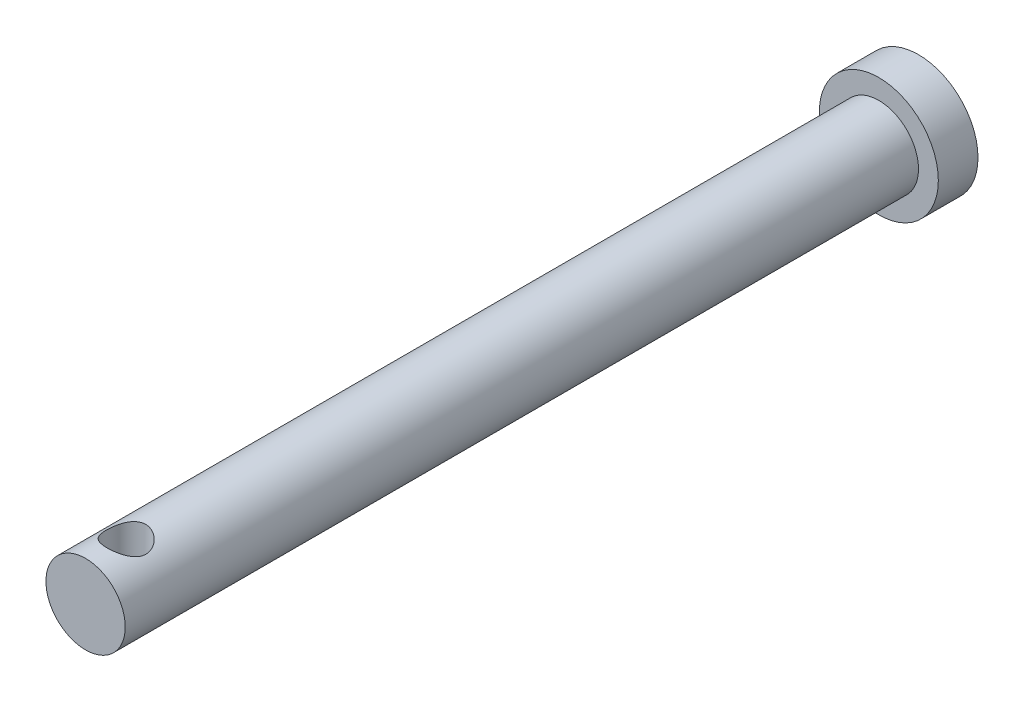
ISO-10303-21;
HEADER;
FILE_DESCRIPTION(('STEP AP214'),'2;1');
FILE_NAME('part.step','',(''),(''),'','','');
FILE_SCHEMA(('AUTOMOTIVE_DESIGN { 1 0 10303 214 1 1 1 1 }'));
ENDSEC;
DATA;
#1=APPLICATION_CONTEXT('core data for automotive mechanical design processes');
#2=APPLICATION_PROTOCOL_DEFINITION('international standard','automotive_design',2000,#1);
#3=PRODUCT_CONTEXT('',#1,'mechanical');
#4=PRODUCT('Part','Part','',(#3));
#5=PRODUCT_RELATED_PRODUCT_CATEGORY('part','',(#4));
#6=PRODUCT_DEFINITION_FORMATION('','',#4);
#7=PRODUCT_DEFINITION_CONTEXT('part definition',#1,'design');
#8=PRODUCT_DEFINITION('design','',#6,#7);
#9=PRODUCT_DEFINITION_SHAPE('','',#8);
#10=(LENGTH_UNIT() NAMED_UNIT(*) SI_UNIT(.MILLI.,.METRE.));
#11=(NAMED_UNIT(*) PLANE_ANGLE_UNIT() SI_UNIT($,.RADIAN.));
#12=(NAMED_UNIT(*) SI_UNIT($,.STERADIAN.) SOLID_ANGLE_UNIT());
#13=UNCERTAINTY_MEASURE_WITH_UNIT(LENGTH_MEASURE(1.E-05),#10,'distance_accuracy_value','');
#14=(GEOMETRIC_REPRESENTATION_CONTEXT(3) GLOBAL_UNCERTAINTY_ASSIGNED_CONTEXT((#13)) GLOBAL_UNIT_ASSIGNED_CONTEXT((#10,
#11,#12)) REPRESENTATION_CONTEXT('',''));
#15=CARTESIAN_POINT('',(0.,0.,0.));
#16=DIRECTION('',(0.,0.,1.));
#17=DIRECTION('',(1.,0.,0.));
#18=AXIS2_PLACEMENT_3D('',#15,#16,#17);
#19=CARTESIAN_POINT('',(0.,0.,-66.6750000000001));
#20=DIRECTION('',(0.,0.,1.));
#21=DIRECTION('',(1.,0.,0.));
#22=AXIS2_PLACEMENT_3D('',#19,#20,#21);
#23=PLANE('',#22);
#24=CARTESIAN_POINT('',(3.175,0.,-66.6750000000001));
#25=DIRECTION('',(0.,0.,1.));
#26=DIRECTION('',(1.,0.,0.));
#27=AXIS2_PLACEMENT_3D('',#24,#25,#26);
#28=CIRCLE('',#27,9.525);
#29=CARTESIAN_POINT('',(12.7,0.,-66.6750000000001));
#30=VERTEX_POINT('',#29);
#31=EDGE_CURVE('E10',#30,#30,#28,.T.);
#32=ORIENTED_EDGE('',*,*,#31,.F.);
#33=EDGE_LOOP('',(#32));
#34=FACE_BOUND('',#33,.T.);
#35=ADVANCED_FACE('F33',(#34),#23,.F.);
#36=CARTESIAN_POINT('',(3.175,0.,66.6749999999999));
#37=DIRECTION('',(0.,0.,1.));
#38=DIRECTION('',(1.,0.,0.));
#39=AXIS2_PLACEMENT_3D('',#36,#37,#38);
#40=CYLINDRICAL_SURFACE('',#39,9.525);
#41=CARTESIAN_POINT('',(3.175,0.,-60.3250000000001));
#42=DIRECTION('',(0.,0.,1.));
#43=DIRECTION('',(1.,0.,0.));
#44=AXIS2_PLACEMENT_3D('',#41,#42,#43);
#45=CIRCLE('',#44,9.525);
#46=CARTESIAN_POINT('',(12.7,0.,-60.3250000000001));
#47=VERTEX_POINT('',#46);
#48=EDGE_CURVE('E44',#47,#47,#45,.T.);
#49=ORIENTED_EDGE('',*,*,#48,.F.);
#50=EDGE_LOOP('',(#49));
#51=FACE_BOUND('',#50,.T.);
#52=ORIENTED_EDGE('',*,*,#31,.T.);
#53=EDGE_LOOP('',(#52));
#54=FACE_BOUND('',#53,.T.);
#55=ADVANCED_FACE('F75',(#51,#54),#40,.T.);
#56=CARTESIAN_POINT('',(1.31838984174237E-13,0.,-60.3250000000001));
#57=DIRECTION('',(0.,0.,1.));
#58=DIRECTION('',(1.,0.,0.));
#59=AXIS2_PLACEMENT_3D('',#56,#57,#58);
#60=PLANE('',#59);
#61=ORIENTED_EDGE('',*,*,#48,.T.);
#62=EDGE_LOOP('',(#61));
#63=FACE_BOUND('',#62,.T.);
#64=CARTESIAN_POINT('',(3.175,0.,-60.3250000000001));
#65=DIRECTION('',(0.,0.,1.));
#66=DIRECTION('',(1.,0.,0.));
#67=AXIS2_PLACEMENT_3D('',#64,#65,#66);
#68=CIRCLE('',#67,6.35);
#69=CARTESIAN_POINT('',(9.525,0.,-60.3250000000001));
#70=VERTEX_POINT('',#69);
#71=EDGE_CURVE('E49',#70,#70,#68,.T.);
#72=ORIENTED_EDGE('',*,*,#71,.F.);
#73=EDGE_LOOP('',(#72));
#74=FACE_BOUND('',#73,.T.);
#75=ADVANCED_FACE('F71',(#63,#74),#60,.T.);
#76=CARTESIAN_POINT('',(3.175,0.,66.6749999999999));
#77=DIRECTION('',(0.,0.,1.));
#78=DIRECTION('',(1.,0.,0.));
#79=AXIS2_PLACEMENT_3D('',#76,#77,#78);
#80=CYLINDRICAL_SURFACE('',#79,6.34999999999999);
#81=CARTESIAN_POINT('',(3.31844053600605,-6.34837969978405,63.4999999999999));
#82=CARTESIAN_POINT('',(3.23541799127475,-6.35025496532474,63.4999991845559));
#83=CARTESIAN_POINT('',(3.15235156623321,-6.35049760049852,63.4967376067175));
#84=CARTESIAN_POINT('',(2.98677217495306,-6.34775153952302,63.4837234864719));
#85=CARTESIAN_POINT('',(2.90425945920507,-6.34476146863294,63.4739681832208));
#86=CARTESIAN_POINT('',(2.65828757723227,-6.33106397100563,63.4350361910045));
#87=CARTESIAN_POINT('',(2.49649686398054,-6.31562715485898,63.39619354226));
#88=CARTESIAN_POINT('',(2.18290676823551,-6.27401570836253,63.2945665040112));
#89=CARTESIAN_POINT('',(2.03107380190596,-6.24787958025927,63.2318680179592));
#90=CARTESIAN_POINT('',(1.74014354255833,-6.18754884083788,63.0847422033609));
#91=CARTESIAN_POINT('',(1.60104561247109,-6.15335463293072,63.0003159625498));
#92=CARTESIAN_POINT('',(1.33086865253448,-6.07802913244367,62.806795825605));
#93=CARTESIAN_POINT('',(1.20066364743802,-6.03661808884404,62.6965925899451));
#94=CARTESIAN_POINT('',(0.959664677687609,-5.95240402707877,62.4570698719344));
#95=CARTESIAN_POINT('',(0.848884101004245,-5.90960007277564,62.3277373173186));
#96=CARTESIAN_POINT('',(0.641191068219398,-5.82373718374866,62.0415438412884));
#97=CARTESIAN_POINT('',(0.546021161423756,-5.78091607148845,61.8833256989401));
#98=CARTESIAN_POINT('',(0.424486915795853,-5.72356423351662,61.6342835455956));
#99=CARTESIAN_POINT('',(0.387502050593569,-5.70558795888675,61.549281774637));
#100=CARTESIAN_POINT('',(0.320961484534511,-5.67259582928666,61.3758809723238));
#101=CARTESIAN_POINT('',(0.291401646352851,-5.6575783266594,61.2874838646985));
#102=CARTESIAN_POINT('',(0.241311118931879,-5.63176049408986,61.1122730610173));
#103=CARTESIAN_POINT('',(0.220413385368521,-5.62079155536659,61.0255889900874));
#104=CARTESIAN_POINT('',(0.185948363464468,-5.60253969448213,60.850432611199));
#105=CARTESIAN_POINT('',(0.17237734724785,-5.59525489792779,60.7619612364488));
#106=CARTESIAN_POINT('',(0.152756711343865,-5.58468206001971,60.5839910938828));
#107=CARTESIAN_POINT('',(0.146703035203655,-5.58139186315029,60.4944929064863));
#108=CARTESIAN_POINT('',(0.142188335604831,-5.57893797927946,60.3152780266279));
#109=CARTESIAN_POINT('',(0.143726643914943,-5.57977392910289,60.2255613540913));
#110=CARTESIAN_POINT('',(0.158567697683241,-5.58782848434591,59.9768479845301));
#111=CARTESIAN_POINT('',(0.180110642731135,-5.59951688541115,59.8183953251168));
#112=CARTESIAN_POINT('',(0.246288894214485,-5.63440306819286,59.5078149854758));
#113=CARTESIAN_POINT('',(0.290930802713813,-5.6576041403424,59.3556891269892));
#114=CARTESIAN_POINT('',(0.402643251342772,-5.71318501949776,59.0583299703551));
#115=CARTESIAN_POINT('',(0.470125328506681,-5.74573145066099,58.913283471526));
#116=CARTESIAN_POINT('',(0.625322322589802,-5.81626143992161,58.6359076549539));
#117=CARTESIAN_POINT('',(0.713046185708784,-5.85424739928575,58.5035839970282));
#118=CARTESIAN_POINT('',(0.918027830011955,-5.93650645323429,58.2394065907146));
#119=CARTESIAN_POINT('',(1.03751942271121,-5.98100083893927,58.1093488291914));
#120=CARTESIAN_POINT('',(1.29692754350404,-6.06745689814302,57.8703663002198));
#121=CARTESIAN_POINT('',(1.43685215436518,-6.10941756003903,57.7614499356532));
#122=CARTESIAN_POINT('',(1.73984333751865,-6.18774341434153,57.564110492134));
#123=CARTESIAN_POINT('',(1.90357443139918,-6.22384424872476,57.4765943823785));
#124=CARTESIAN_POINT('',(2.24566156805352,-6.28401879695402,57.3309641675517));
#125=CARTESIAN_POINT('',(2.42400594858425,-6.30810199480078,57.2728268770325));
#126=CARTESIAN_POINT('',(2.77440108162844,-6.33958789719931,57.1922293005538));
#127=CARTESIAN_POINT('',(2.94575607965788,-6.3482034423909,57.1672200937245));
#128=CARTESIAN_POINT('',(3.29035074847106,-6.3512858537728,57.1454397677599));
#129=CARTESIAN_POINT('',(3.46358962186577,-6.34575849061788,57.1486571327895));
#130=CARTESIAN_POINT('',(3.79419687345278,-6.32176136858517,57.1817609156527));
#131=CARTESIAN_POINT('',(3.95182801904055,-6.3042235089271,57.209767013578));
#132=CARTESIAN_POINT('',(4.25966429032727,-6.2586124124449,57.2885584619767));
#133=CARTESIAN_POINT('',(4.40986840833464,-6.23053775041298,57.3393468941699));
#134=CARTESIAN_POINT('',(4.70481791632526,-6.16488640261664,57.4640288818756));
#135=CARTESIAN_POINT('',(4.84916513061532,-6.12700083018195,57.5386967198258));
#136=CARTESIAN_POINT('',(5.12366021935579,-6.04530940715879,57.7081582883201));
#137=CARTESIAN_POINT('',(5.25380169575764,-6.00150090869621,57.8029610311598));
#138=CARTESIAN_POINT('',(5.51041655147483,-5.90668347518298,58.0212894969819));
#139=CARTESIAN_POINT('',(5.63513080951343,-5.85539769762647,58.1467681165211));
#140=CARTESIAN_POINT('',(5.86243832299691,-5.75462090973305,58.4171320726089));
#141=CARTESIAN_POINT('',(5.96501471202192,-5.70513129156652,58.5620320706467));
#142=CARTESIAN_POINT('',(6.14967398450733,-5.61115743939084,58.8760863494904));
#143=CARTESIAN_POINT('',(6.23056713806133,-5.56701776302611,59.0460604776953));
#144=CARTESIAN_POINT('',(6.32882525895149,-5.51155976081992,59.311518369946));
#145=CARTESIAN_POINT('',(6.35773147195762,-5.4948653913956,59.4017562088219));
#146=CARTESIAN_POINT('',(6.40747588545473,-5.46575113153112,59.5850790468563));
#147=CARTESIAN_POINT('',(6.42831950447503,-5.4533283709486,59.678162088321));
#148=CARTESIAN_POINT('',(6.45979285760859,-5.43442123418594,59.856171173537));
#149=CARTESIAN_POINT('',(6.47128185303713,-5.42744082092643,59.9408939529506));
#150=CARTESIAN_POINT('',(6.48738672994077,-5.41762716249608,60.1111907769561));
#151=CARTESIAN_POINT('',(6.49200621280457,-5.4147917442966,60.1967643518068));
#152=CARTESIAN_POINT('',(6.49430318204363,-5.41338435397653,60.3680301652434));
#153=CARTESIAN_POINT('',(6.49198179111163,-5.41481169235109,60.4537223823976));
#154=CARTESIAN_POINT('',(6.48044779346861,-5.42185875581726,60.6244423568351));
#155=CARTESIAN_POINT('',(6.47123548805251,-5.42747829761101,60.7094701430053));
#156=CARTESIAN_POINT('',(6.43608411860811,-5.4487222555571,60.9448138557055));
#157=CARTESIAN_POINT('',(6.40268197773187,-5.46874250371598,61.0936942297387));
#158=CARTESIAN_POINT('',(6.3156514298894,-5.51917493220954,61.3834449369612));
#159=CARTESIAN_POINT('',(6.26201633094328,-5.54959055046323,61.5243126022164));
#160=CARTESIAN_POINT('',(6.13165091077864,-5.62019512410435,61.8056189181218));
#161=CARTESIAN_POINT('',(6.05351151817053,-5.6609385680018,61.9452631941481));
#162=CARTESIAN_POINT('',(5.87798053313993,-5.74681960223108,62.2103886151877));
#163=CARTESIAN_POINT('',(5.78057852098538,-5.79195956403557,62.3358620367914));
#164=CARTESIAN_POINT('',(5.55395749765022,-5.88899257950287,62.5867246832719));
#165=CARTESIAN_POINT('',(5.42221753000284,-5.94097382075677,62.7098107675804));
#166=CARTESIAN_POINT('',(5.13858456864429,-6.04064316525032,62.9327180216583));
#167=CARTESIAN_POINT('',(4.98667884719846,-6.08832852494589,63.0325243876962));
#168=CARTESIAN_POINT('',(4.7449793282468,-6.15344140463748,63.1629958193227));
#169=CARTESIAN_POINT('',(4.66129574858215,-6.17423223186521,63.2035526220836));
#170=CARTESIAN_POINT('',(4.49014191890728,-6.21293641209737,63.2773568387945));
#171=CARTESIAN_POINT('',(4.40267354492752,-6.23085117041907,63.3106078254898));
#172=CARTESIAN_POINT('',(4.22477500998407,-6.26327657427141,63.369329249219));
#173=CARTESIAN_POINT('',(4.13435189320643,-6.27779472627811,63.3948168816106));
#174=CARTESIAN_POINT('',(3.95114388975493,-6.30306591195821,63.437740471815));
#175=CARTESIAN_POINT('',(3.8583604953942,-6.31382126420995,63.4551813900066));
#176=CARTESIAN_POINT('',(3.6910819397588,-6.32942717444379,63.4789359609763));
#177=CARTESIAN_POINT('',(3.61687765410597,-6.3350460275193,63.4868243610374));
#178=CARTESIAN_POINT('',(3.46794097094833,-6.3436779456772,63.4973568763986));
#179=CARTESIAN_POINT('',(3.39320854771029,-6.34669088289282,63.5000007343683));
#180=CARTESIAN_POINT('',(3.31844053600605,-6.34837969978405,63.4999999999999));
#181=B_SPLINE_CURVE_WITH_KNOTS('',3,(#81,#82,#83,#84,#85,#86,#87,#88,#89,#90,#91,#92,#93,#94,
#95,#96,#97,#98,#99,#100,#101,#102,#103,#104,#105,#106,#107,#108,#109,#110,#111,#112,#113,#114,
#115,#116,#117,#118,#119,#120,#121,#122,#123,#124,#125,#126,#127,#128,#129,#130,#131,#132,#133,
#134,#135,#136,#137,#138,#139,#140,#141,#142,#143,#144,#145,#146,#147,#148,#149,#150,#151,#152,
#153,#154,#155,#156,#157,#158,#159,#160,#161,#162,#163,#164,#165,#166,#167,#168,#169,#170,#171,
#172,#173,#174,#175,#176,#177,#178,#179,#180),.UNSPECIFIED.,.T.,.F.,(4,2,2,2,2,2,2,2,2,2,2,2,2,
2,2,2,2,2,2,2,2,2,2,2,2,2,2,2,2,2,2,2,2,2,2,2,2,2,2,2,2,2,2,2,2,2,2,2,2,4),(0.,
0.249053803353594,0.498213561018744,0.996835539183493,1.49367874645147,1.99049708558193,
2.51489984093226,3.0396626236166,3.60513498705206,3.88809065917906,4.1708883130873,
4.44003159099173,4.70903779787898,4.97789878240911,5.2467361027557,5.72526209450597,
6.20392493247051,6.69171720389444,7.17972547770747,7.7237277113061,8.26794572383766,
8.83229239057339,9.39619298271097,9.91354442740296,10.4306848136344,10.9116688290733,
11.3927179258655,11.8912908083979,12.3900873220532,12.9402702903754,13.4908709642982,
14.0673488449289,14.3556024255104,14.6436619450378,14.9006472453877,15.1574977718901,
15.4143067548309,15.6711045098398,16.1305764878468,16.59020056803,17.0836470001639,
17.5773610860691,18.137799523804,18.698593382416,18.9841303100529,19.2695272899389,
19.5542874574156,19.8388718498088,20.0631524248657,20.2874440042722),.UNSPECIFIED.);
#182=CARTESIAN_POINT('',(3.31844053600605,-6.34837969978405,63.4999999999999));
#183=VERTEX_POINT('',#182);
#184=EDGE_CURVE('E36',#183,#183,#181,.T.);
#185=ORIENTED_EDGE('',*,*,#184,.F.);
#186=EDGE_LOOP('',(#185));
#187=FACE_BOUND('',#186,.T.);
#188=CARTESIAN_POINT('',(3.31844053600605,6.34837969978405,63.4999999999999));
#189=CARTESIAN_POINT('',(3.40243284943176,6.34648115273982,63.4999990491056));
#190=CARTESIAN_POINT('',(3.48639803354145,6.34291128651111,63.4966607697409));
#191=CARTESIAN_POINT('',(3.65360966856173,6.33249355325176,63.4833758500984));
#192=CARTESIAN_POINT('',(3.73685577148423,6.32564418072635,63.4734261739692));
#193=CARTESIAN_POINT('',(3.98480674045141,6.300334439918,63.433785568256));
#194=CARTESIAN_POINT('',(4.147584743129,6.27711588689525,63.394303347042));
#195=CARTESIAN_POINT('',(4.46245619583831,6.22017240218725,63.2913523768556));
#196=CARTESIAN_POINT('',(4.61459122231003,6.18649151655408,63.2279839535366));
#197=CARTESIAN_POINT('',(4.90574658231178,6.11143343879688,63.079593025238));
#198=CARTESIAN_POINT('',(5.04476835798905,6.070057094482,62.9945729052465));
#199=CARTESIAN_POINT('',(5.31595284611843,5.98001340381142,62.7989305753977));
#200=CARTESIAN_POINT('',(5.4470667059377,5.93104577776729,62.6869943738683));
#201=CARTESIAN_POINT('',(5.68949255046576,5.83240824483656,62.4435632173238));
#202=CARTESIAN_POINT('',(5.80078776315524,5.7827377811636,62.3120518675034));
#203=CARTESIAN_POINT('',(6.00907628916402,5.683733313776,62.020734135011));
#204=CARTESIAN_POINT('',(6.10429770181868,5.63472245544884,61.8595260256956));
#205=CARTESIAN_POINT('',(6.22532167693552,5.56957302487909,61.605429007908));
#206=CARTESIAN_POINT('',(6.26203541845307,5.54924657812523,61.5186569269833));
#207=CARTESIAN_POINT('',(6.32778924913408,5.51215424281762,61.3415382156427));
#208=CARTESIAN_POINT('',(6.35683417171245,5.49538611288347,61.2511938781948));
#209=CARTESIAN_POINT('',(6.40505379780669,5.46717274320859,61.0741675741642));
#210=CARTESIAN_POINT('',(6.42478452910759,5.45543325784579,60.9876836610256));
#211=CARTESIAN_POINT('',(6.45697681943444,5.43612740587535,60.8129554379823));
#212=CARTESIAN_POINT('',(6.46944240909142,5.42855872547227,60.7247121323307));
#213=CARTESIAN_POINT('',(6.48690362889183,5.41792420777482,60.5472706275973));
#214=CARTESIAN_POINT('',(6.49190422403608,5.41485537763431,60.4580731029731));
#215=CARTESIAN_POINT('',(6.49437206417709,5.41334101122189,60.2795647073978));
#216=CARTESIAN_POINT('',(6.49184008385155,5.41489499952238,60.1902538490466));
#217=CARTESIAN_POINT('',(6.47462083071647,5.42542469361773,59.9467346691606));
#218=CARTESIAN_POINT('',(6.45235386100408,5.43902401893617,59.7931804041488));
#219=CARTESIAN_POINT('',(6.38623320104335,5.47831255849145,59.4925091974554));
#220=CARTESIAN_POINT('',(6.34237187777997,5.50400604754419,59.3453945520405));
#221=CARTESIAN_POINT('',(6.23329019195345,5.5653721525297,59.0566288641903));
#222=CARTESIAN_POINT('',(6.1675003765361,5.60130665435006,58.9152503521416));
#223=CARTESIAN_POINT('',(6.01690283303744,5.67919595772478,58.6448470339732));
#224=CARTESIAN_POINT('',(5.93208647235831,5.72115348888671,58.5158278734941));
#225=CARTESIAN_POINT('',(5.73209005508965,5.81356492138338,58.2548347167988));
#226=CARTESIAN_POINT('',(5.6143234995131,5.86438693106848,58.1249657524799));
#227=CARTESIAN_POINT('',(5.35861940151955,5.96432385936856,57.8859537532756));
#228=CARTESIAN_POINT('',(5.22067064080815,6.01343780964201,57.7768223234288));
#229=CARTESIAN_POINT('',(4.91878878583636,6.10803357230766,57.57652395407));
#230=CARTESIAN_POINT('',(4.75382770757884,6.15315317630151,57.4867210713246));
#231=CARTESIAN_POINT('',(4.40828108623777,6.23159729692509,57.3369829297765));
#232=CARTESIAN_POINT('',(4.22770810223351,6.2649311867568,57.277023920535));
#233=CARTESIAN_POINT('',(3.87202448220869,6.31396676770406,57.1937517250873));
#234=CARTESIAN_POINT('',(3.69770029224691,6.33090024412068,57.1678145156134));
#235=CARTESIAN_POINT('',(3.34639553416203,6.35011828948552,57.1452559288008));
#236=CARTESIAN_POINT('',(3.16941646434916,6.35241083091872,57.1486185943284));
#237=CARTESIAN_POINT('',(2.83389534905894,6.34286457903664,57.1830503342826));
#238=CARTESIAN_POINT('',(2.67506632064787,6.33221214013894,57.2117364579208));
#239=CARTESIAN_POINT('',(2.36462536475914,6.3000122136449,57.2924124159535));
#240=CARTESIAN_POINT('',(2.21301404788583,6.27846380605654,57.3444042181014));
#241=CARTESIAN_POINT('',(1.91757401366535,6.22610420130268,57.4711286400929));
#242=CARTESIAN_POINT('',(1.77397126549691,6.19511055397741,57.5463095784034));
#243=CARTESIAN_POINT('',(1.50085148737177,6.12695440787539,57.7167558684803));
#244=CARTESIAN_POINT('',(1.37134016415488,6.08978942511176,57.8120293117459));
#245=CARTESIAN_POINT('',(1.1172497256171,6.00895651623573,58.0302265659099));
#246=CARTESIAN_POINT('',(0.99426293148592,5.96500545427719,58.154902423933));
#247=CARTESIAN_POINT('',(0.770159930598614,5.87824082339337,58.4230402311758));
#248=CARTESIAN_POINT('',(0.669057569890728,5.83542798954917,58.56651398202));
#249=CARTESIAN_POINT('',(0.48682384311537,5.7538410856892,58.8770523354803));
#250=CARTESIAN_POINT('',(0.406937615894591,5.71537428092742,59.044935894008));
#251=CARTESIAN_POINT('',(0.277274598777741,5.65075296634303,59.39412908756));
#252=CARTESIAN_POINT('',(0.227464769902661,5.62458495330712,59.575423743728));
#253=CARTESIAN_POINT('',(0.163415723756521,5.59053441937761,59.9299236121273));
#254=CARTESIAN_POINT('',(0.146524242229254,5.58129249620031,60.1025160628869));
#255=CARTESIAN_POINT('',(0.141132338078151,5.57836664944477,60.4482449341827));
#256=CARTESIAN_POINT('',(0.15262034462293,5.58467638517107,60.6213811042879));
#257=CARTESIAN_POINT('',(0.201075274910246,5.61060615173691,60.9474737226798));
#258=CARTESIAN_POINT('',(0.235748321953064,5.62902553666515,61.1008788440299));
#259=CARTESIAN_POINT('',(0.326728748324898,5.67560087610303,61.399557869937));
#260=CARTESIAN_POINT('',(0.383042876530134,5.70375986768219,61.5448292217306));
#261=CARTESIAN_POINT('',(0.519597508560008,5.76865447325289,61.8330042778654));
#262=CARTESIAN_POINT('',(0.60109500020358,5.80581059688736,61.9752146915456));
#263=CARTESIAN_POINT('',(0.784388240171331,5.88365360518275,62.2448442479084));
#264=CARTESIAN_POINT('',(0.886194053581899,5.92434223493269,62.3722560064302));
#265=CARTESIAN_POINT('',(1.12021998568646,6.00978634098409,62.6230390248952));
#266=CARTESIAN_POINT('',(1.25454257807302,6.05450349681587,62.7444681332447));
#267=CARTESIAN_POINT('',(1.54315475829963,6.13857428346632,62.9635125099911));
#268=CARTESIAN_POINT('',(1.69745320657459,6.17792551819266,63.0611171551086));
#269=CARTESIAN_POINT('',(1.94074466077048,6.22944818678792,63.1869807557053));
#270=CARTESIAN_POINT('',(2.02378064627839,6.24536690495482,63.2255002320861));
#271=CARTESIAN_POINT('',(2.19329836315292,6.27424363481168,63.2953649505069));
#272=CARTESIAN_POINT('',(2.27977837518277,6.2872031025967,63.326713720896));
#273=CARTESIAN_POINT('',(2.45534467002857,6.30970812343615,63.3818188101524));
#274=CARTESIAN_POINT('',(2.54442489660291,6.31926101623699,63.4055914405354));
#275=CARTESIAN_POINT('',(2.72458280585365,6.33464967032719,63.4453296566623));
#276=CARTESIAN_POINT('',(2.81565924490057,6.3404876814955,63.4612999664358));
#277=CARTESIAN_POINT('',(2.97542060120374,6.34722924528818,63.4821635511496));
#278=CARTESIAN_POINT('',(3.04384060844332,6.34901567717815,63.4888492728698));
#279=CARTESIAN_POINT('',(3.18099330741996,6.35036751459759,63.4977678957077));
#280=CARTESIAN_POINT('',(3.24972600048256,6.34993291070291,63.5000007779314));
#281=CARTESIAN_POINT('',(3.31844053600605,6.34837969978405,63.4999999999999));
#282=B_SPLINE_CURVE_WITH_KNOTS('',3,(#188,#189,#190,#191,#192,#193,#194,#195,#196,#197,#198,
#199,#200,#201,#202,#203,#204,#205,#206,#207,#208,#209,#210,#211,#212,#213,#214,#215,#216,#217,
#218,#219,#220,#221,#222,#223,#224,#225,#226,#227,#228,#229,#230,#231,#232,#233,#234,#235,#236,
#237,#238,#239,#240,#241,#242,#243,#244,#245,#246,#247,#248,#249,#250,#251,#252,#253,#254,#255,
#256,#257,#258,#259,#260,#261,#262,#263,#264,#265,#266,#267,#268,#269,#270,#271,#272,#273,#274,
#275,#276,#277,#278,#279,#280,#281),.UNSPECIFIED.,.T.,.F.,(4,2,2,2,2,2,2,2,2,2,2,2,2,2,2,2,2,2,
2,2,2,2,2,2,2,2,2,2,2,2,2,2,2,2,2,2,2,2,2,2,2,2,2,2,2,2,4),(0.,0.251968295983379,
0.50405237194955,1.0086334832085,1.51111847481576,2.01354814037766,2.54894994850081,
3.0848027223217,3.66209974668157,3.95090743297157,4.23953265600225,4.50758209745345,
4.77548268573143,5.04320501263457,5.31089980694271,5.77577570269788,6.24081603750655,
6.71901997352876,7.19744131747932,7.74269628572096,8.28825549404551,8.86465119034459,
9.4405874413685,9.96881852512042,10.4967619446126,10.9797627623529,11.4628043686753,
11.9558416870158,12.4490779380066,12.988413829819,13.5280899627299,14.0946391899256,
14.6605649241424,15.1786240279458,15.6964719445316,16.1694507141555,16.6425771043596,
17.1447593060829,17.6471910174312,18.2041973353046,18.7614515692929,19.0398588634555,
19.3181288710757,19.5957956480207,19.8732940985469,20.0794297585169,20.285566293147),.UNSPECIFIED.);
#283=CARTESIAN_POINT('',(3.31844053600605,6.34837969978405,63.4999999999999));
#284=VERTEX_POINT('',#283);
#285=EDGE_CURVE('E52',#284,#284,#282,.T.);
#286=ORIENTED_EDGE('',*,*,#285,.F.);
#287=EDGE_LOOP('',(#286));
#288=FACE_BOUND('',#287,.T.);
#289=ORIENTED_EDGE('',*,*,#71,.T.);
#290=EDGE_LOOP('',(#289));
#291=FACE_BOUND('',#290,.T.);
#292=CARTESIAN_POINT('',(3.175,0.,66.6749999999999));
#293=DIRECTION('',(0.,0.,1.));
#294=DIRECTION('',(1.,0.,0.));
#295=AXIS2_PLACEMENT_3D('',#292,#293,#294);
#296=CIRCLE('',#295,6.34999999999999);
#297=CARTESIAN_POINT('',(9.52499999999998,0.,66.6749999999999));
#298=VERTEX_POINT('',#297);
#299=EDGE_CURVE('E90',#298,#298,#296,.T.);
#300=ORIENTED_EDGE('',*,*,#299,.F.);
#301=EDGE_LOOP('',(#300));
#302=FACE_BOUND('',#301,.T.);
#303=ADVANCED_FACE('F56',(#187,#288,#291,#302),#80,.T.);
#304=CARTESIAN_POINT('',(0.,0.,66.6749999999999));
#305=DIRECTION('',(0.,0.,-1.));
#306=DIRECTION('',(-1.,0.,0.));
#307=AXIS2_PLACEMENT_3D('',#304,#305,#306);
#308=PLANE('',#307);
#309=ORIENTED_EDGE('',*,*,#299,.T.);
#310=EDGE_LOOP('',(#309));
#311=FACE_BOUND('',#310,.T.);
#312=ADVANCED_FACE('F63',(#311),#308,.F.);
#313=CARTESIAN_POINT('',(3.31844053600605,-9.525,60.3249999999999));
#314=DIRECTION('',(0.,1.,0.));
#315=DIRECTION('',(0.,0.,1.));
#316=AXIS2_PLACEMENT_3D('',#313,#314,#315);
#317=CYLINDRICAL_SURFACE('',#316,3.175);
#318=ORIENTED_EDGE('',*,*,#184,.T.);
#319=EDGE_LOOP('',(#318));
#320=FACE_BOUND('',#319,.T.);
#321=ORIENTED_EDGE('',*,*,#285,.T.);
#322=EDGE_LOOP('',(#321));
#323=FACE_BOUND('',#322,.T.);
#324=ADVANCED_FACE('F60',(#320,#323),#317,.F.);
#325=CLOSED_SHELL('',(#35,#55,#75,#303,#312,#324));
#326=MANIFOLD_SOLID_BREP('B2',#325);
#327=ADVANCED_BREP_SHAPE_REPRESENTATION('',(#18,#326),#14);
#328=SHAPE_DEFINITION_REPRESENTATION(#9,#327);
ENDSEC;
END-ISO-10303-21;
